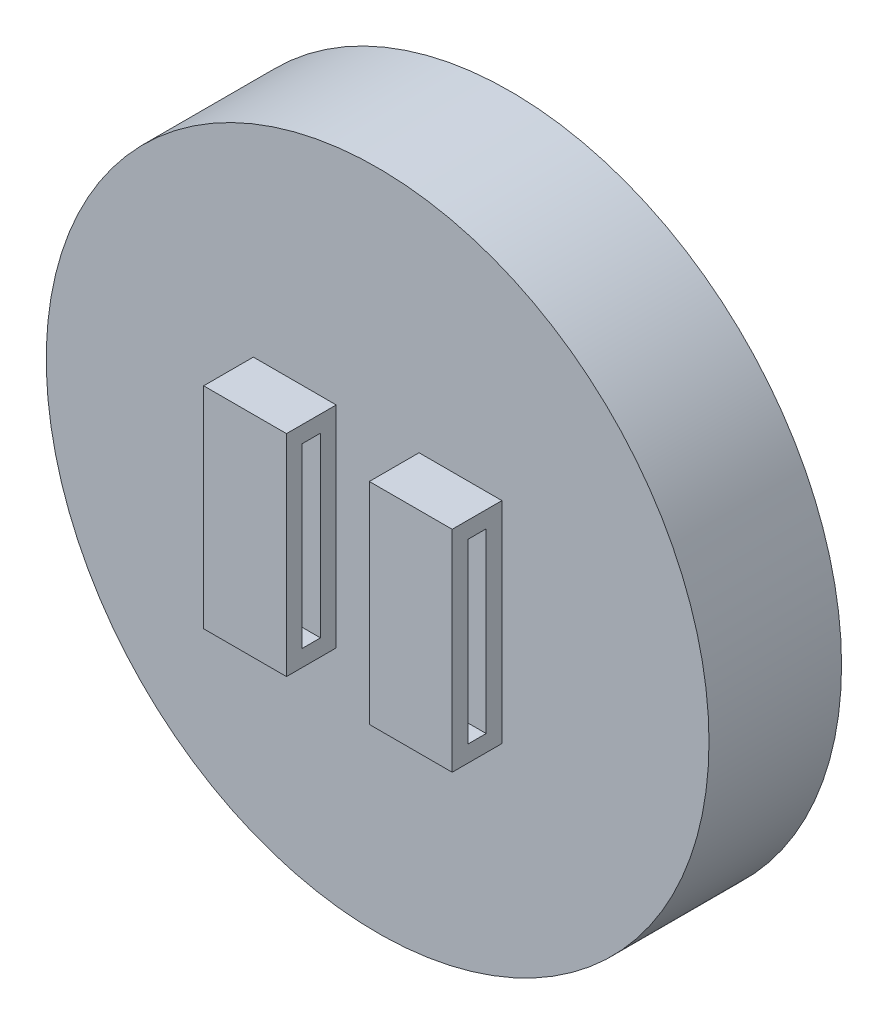
ISO-10303-21;
HEADER;
FILE_DESCRIPTION(('STEP AP214'),'2;1');
FILE_NAME('part.step','',(''),(''),'','','');
FILE_SCHEMA(('AUTOMOTIVE_DESIGN { 1 0 10303 214 1 1 1 1 }'));
ENDSEC;
DATA;
#1=APPLICATION_CONTEXT('core data for automotive mechanical design processes');
#2=APPLICATION_PROTOCOL_DEFINITION('international standard','automotive_design',2000,#1);
#3=PRODUCT_CONTEXT('',#1,'mechanical');
#4=PRODUCT('Part','Part','',(#3));
#5=PRODUCT_RELATED_PRODUCT_CATEGORY('part','',(#4));
#6=PRODUCT_DEFINITION_FORMATION('','',#4);
#7=PRODUCT_DEFINITION_CONTEXT('part definition',#1,'design');
#8=PRODUCT_DEFINITION('design','',#6,#7);
#9=PRODUCT_DEFINITION_SHAPE('','',#8);
#10=(LENGTH_UNIT() NAMED_UNIT(*) SI_UNIT(.MILLI.,.METRE.));
#11=(NAMED_UNIT(*) PLANE_ANGLE_UNIT() SI_UNIT($,.RADIAN.));
#12=(NAMED_UNIT(*) SI_UNIT($,.STERADIAN.) SOLID_ANGLE_UNIT());
#13=UNCERTAINTY_MEASURE_WITH_UNIT(LENGTH_MEASURE(1.E-05),#10,'distance_accuracy_value','');
#14=(GEOMETRIC_REPRESENTATION_CONTEXT(3) GLOBAL_UNCERTAINTY_ASSIGNED_CONTEXT((#13)) GLOBAL_UNIT_ASSIGNED_CONTEXT((#10,
#11,#12)) REPRESENTATION_CONTEXT('',''));
#15=CARTESIAN_POINT('',(0.,0.,0.));
#16=DIRECTION('',(0.,0.,1.));
#17=DIRECTION('',(1.,0.,0.));
#18=AXIS2_PLACEMENT_3D('',#15,#16,#17);
#19=CARTESIAN_POINT('',(0.,0.,8.));
#20=DIRECTION('',(0.,0.,-1.));
#21=DIRECTION('',(-1.,0.,0.));
#22=AXIS2_PLACEMENT_3D('',#19,#20,#21);
#23=CYLINDRICAL_SURFACE('',#22,20.);
#24=CARTESIAN_POINT('',(0.,0.,8.));
#25=DIRECTION('',(0.,0.,1.));
#26=DIRECTION('',(1.,0.,0.));
#27=AXIS2_PLACEMENT_3D('',#24,#25,#26);
#28=CIRCLE('',#27,20.);
#29=CARTESIAN_POINT('',(20.,0.,8.));
#30=VERTEX_POINT('',#29);
#31=EDGE_CURVE('E321',#30,#30,#28,.T.);
#32=ORIENTED_EDGE('',*,*,#31,.F.);
#33=EDGE_LOOP('',(#32));
#34=FACE_BOUND('',#33,.T.);
#35=CARTESIAN_POINT('',(0.,0.,0.));
#36=DIRECTION('',(0.,0.,1.));
#37=DIRECTION('',(1.,0.,0.));
#38=AXIS2_PLACEMENT_3D('',#35,#36,#37);
#39=CIRCLE('',#38,20.);
#40=CARTESIAN_POINT('',(20.,0.,0.));
#41=VERTEX_POINT('',#40);
#42=EDGE_CURVE('E317',#41,#41,#39,.T.);
#43=ORIENTED_EDGE('',*,*,#42,.T.);
#44=EDGE_LOOP('',(#43));
#45=FACE_BOUND('',#44,.T.);
#46=ADVANCED_FACE('F44',(#34,#45),#23,.T.);
#47=CARTESIAN_POINT('',(0.,0.,8.));
#48=DIRECTION('',(0.,0.,1.));
#49=DIRECTION('',(1.,0.,0.));
#50=AXIS2_PLACEMENT_3D('',#47,#48,#49);
#51=PLANE('',#50);
#52=DIRECTION('',(0.,1.,0.));
#53=VECTOR('',#52,1.);
#54=CARTESIAN_POINT('',(2.5,0.,8.));
#55=LINE('',#54,#53);
#56=CARTESIAN_POINT('',(2.5,-6.35,8.));
#57=VERTEX_POINT('',#56);
#58=CARTESIAN_POINT('',(2.5,6.35,8.));
#59=VERTEX_POINT('',#58);
#60=EDGE_CURVE('E223',#57,#59,#55,.T.);
#61=ORIENTED_EDGE('',*,*,#60,.T.);
#62=DIRECTION('',(1.,0.,0.));
#63=VECTOR('',#62,1.);
#64=CARTESIAN_POINT('',(0.,6.35,8.));
#65=LINE('',#64,#63);
#66=CARTESIAN_POINT('',(7.5,6.35,8.));
#67=VERTEX_POINT('',#66);
#68=EDGE_CURVE('E229',#59,#67,#65,.T.);
#69=ORIENTED_EDGE('',*,*,#68,.T.);
#70=DIRECTION('',(0.,1.,0.));
#71=VECTOR('',#70,1.);
#72=CARTESIAN_POINT('',(7.5,0.,8.));
#73=LINE('',#72,#71);
#74=CARTESIAN_POINT('',(7.5,-6.35,8.));
#75=VERTEX_POINT('',#74);
#76=EDGE_CURVE('E246',#75,#67,#73,.T.);
#77=ORIENTED_EDGE('',*,*,#76,.F.);
#78=DIRECTION('',(1.,0.,0.));
#79=VECTOR('',#78,1.);
#80=CARTESIAN_POINT('',(0.,-6.35,8.));
#81=LINE('',#80,#79);
#82=EDGE_CURVE('E242',#57,#75,#81,.T.);
#83=ORIENTED_EDGE('',*,*,#82,.F.);
#84=EDGE_LOOP('',(#61,#69,#77,#83));
#85=FACE_BOUND('',#84,.T.);
#86=DIRECTION('',(1.,0.,0.));
#87=VECTOR('',#86,1.);
#88=CARTESIAN_POINT('',(0.,-6.35,8.));
#89=LINE('',#88,#87);
#90=CARTESIAN_POINT('',(-7.5,-6.35,8.));
#91=VERTEX_POINT('',#90);
#92=CARTESIAN_POINT('',(-2.5,-6.35,8.));
#93=VERTEX_POINT('',#92);
#94=EDGE_CURVE('E267',#91,#93,#89,.T.);
#95=ORIENTED_EDGE('',*,*,#94,.F.);
#96=DIRECTION('',(0.,1.,0.));
#97=VECTOR('',#96,1.);
#98=CARTESIAN_POINT('',(-7.5,0.,8.));
#99=LINE('',#98,#97);
#100=CARTESIAN_POINT('',(-7.5,6.35,8.));
#101=VERTEX_POINT('',#100);
#102=EDGE_CURVE('E273',#91,#101,#99,.T.);
#103=ORIENTED_EDGE('',*,*,#102,.T.);
#104=DIRECTION('',(1.,0.,0.));
#105=VECTOR('',#104,1.);
#106=CARTESIAN_POINT('',(0.,6.35,8.));
#107=LINE('',#106,#105);
#108=CARTESIAN_POINT('',(-2.5,6.35,8.));
#109=VERTEX_POINT('',#108);
#110=EDGE_CURVE('E292',#101,#109,#107,.T.);
#111=ORIENTED_EDGE('',*,*,#110,.T.);
#112=DIRECTION('',(0.,1.,0.));
#113=VECTOR('',#112,1.);
#114=CARTESIAN_POINT('',(-2.5,0.,8.));
#115=LINE('',#114,#113);
#116=EDGE_CURVE('E288',#93,#109,#115,.T.);
#117=ORIENTED_EDGE('',*,*,#116,.F.);
#118=EDGE_LOOP('',(#95,#103,#111,#117));
#119=FACE_BOUND('',#118,.T.);
#120=ORIENTED_EDGE('',*,*,#31,.T.);
#121=EDGE_LOOP('',(#120));
#122=FACE_BOUND('',#121,.T.);
#123=ADVANCED_FACE('F372',(#85,#119,#122),#51,.T.);
#124=CARTESIAN_POINT('',(0.,0.,0.));
#125=DIRECTION('',(0.,0.,1.));
#126=DIRECTION('',(1.,0.,0.));
#127=AXIS2_PLACEMENT_3D('',#124,#125,#126);
#128=PLANE('',#127);
#129=CARTESIAN_POINT('',(0.,0.,0.));
#130=DIRECTION('',(0.,0.,-1.));
#131=DIRECTION('',(-1.,0.,0.));
#132=AXIS2_PLACEMENT_3D('',#129,#130,#131);
#133=CIRCLE('',#132,16.);
#134=CARTESIAN_POINT('',(-16.,0.,0.));
#135=VERTEX_POINT('',#134);
#136=EDGE_CURVE('E312',#135,#135,#133,.T.);
#137=ORIENTED_EDGE('',*,*,#136,.F.);
#138=EDGE_LOOP('',(#137));
#139=FACE_BOUND('',#138,.T.);
#140=ORIENTED_EDGE('',*,*,#42,.F.);
#141=EDGE_LOOP('',(#140));
#142=FACE_BOUND('',#141,.T.);
#143=ADVANCED_FACE('F397',(#139,#142),#128,.F.);
#144=CARTESIAN_POINT('',(0.,0.,6.35));
#145=DIRECTION('',(0.,0.,-1.));
#146=DIRECTION('',(-1.,0.,0.));
#147=AXIS2_PLACEMENT_3D('',#144,#145,#146);
#148=CYLINDRICAL_SURFACE('',#147,16.);
#149=CARTESIAN_POINT('',(0.,0.,6.35));
#150=DIRECTION('',(0.,0.,-1.));
#151=DIRECTION('',(-1.,0.,0.));
#152=AXIS2_PLACEMENT_3D('',#149,#150,#151);
#153=CIRCLE('',#152,16.);
#154=CARTESIAN_POINT('',(-16.,0.,6.35));
#155=VERTEX_POINT('',#154);
#156=EDGE_CURVE('E313',#155,#155,#153,.T.);
#157=ORIENTED_EDGE('',*,*,#156,.F.);
#158=EDGE_LOOP('',(#157));
#159=FACE_BOUND('',#158,.T.);
#160=ORIENTED_EDGE('',*,*,#136,.T.);
#161=EDGE_LOOP('',(#160));
#162=FACE_BOUND('',#161,.T.);
#163=ADVANCED_FACE('F404',(#159,#162),#148,.F.);
#164=CARTESIAN_POINT('',(0.,0.,6.35));
#165=DIRECTION('',(0.,0.,-1.));
#166=DIRECTION('',(-1.,0.,0.));
#167=AXIS2_PLACEMENT_3D('',#164,#165,#166);
#168=PLANE('',#167);
#169=ORIENTED_EDGE('',*,*,#156,.T.);
#170=EDGE_LOOP('',(#169));
#171=FACE_BOUND('',#170,.T.);
#172=ADVANCED_FACE('F409',(#171),#168,.T.);
#173=CARTESIAN_POINT('',(0.,-6.35,11.));
#174=DIRECTION('',(0.,1.,0.));
#175=DIRECTION('',(-1.,0.,0.));
#176=AXIS2_PLACEMENT_3D('',#173,#174,#175);
#177=PLANE('',#176);
#178=ORIENTED_EDGE('',*,*,#94,.T.);
#179=DIRECTION('',(0.,0.,-1.));
#180=VECTOR('',#179,1.);
#181=CARTESIAN_POINT('',(-2.5,-6.35,11.));
#182=LINE('',#181,#180);
#183=CARTESIAN_POINT('',(-2.5,-6.35,11.));
#184=VERTEX_POINT('',#183);
#185=EDGE_CURVE('E308',#184,#93,#182,.T.);
#186=ORIENTED_EDGE('',*,*,#185,.F.);
#187=DIRECTION('',(1.,0.,0.));
#188=VECTOR('',#187,1.);
#189=CARTESIAN_POINT('',(0.,-6.35,11.));
#190=LINE('',#189,#188);
#191=CARTESIAN_POINT('',(-7.5,-6.35,11.));
#192=VERTEX_POINT('',#191);
#193=EDGE_CURVE('E268',#192,#184,#190,.T.);
#194=ORIENTED_EDGE('',*,*,#193,.F.);
#195=DIRECTION('',(0.,0.,-1.));
#196=VECTOR('',#195,1.);
#197=CARTESIAN_POINT('',(-7.5,-6.35,11.));
#198=LINE('',#197,#196);
#199=EDGE_CURVE('E284',#192,#91,#198,.T.);
#200=ORIENTED_EDGE('',*,*,#199,.T.);
#201=EDGE_LOOP('',(#178,#186,#194,#200));
#202=FACE_BOUND('',#201,.T.);
#203=ADVANCED_FACE('F416',(#202),#177,.F.);
#204=CARTESIAN_POINT('',(-2.5,0.,11.));
#205=DIRECTION('',(-1.,0.,0.));
#206=DIRECTION('',(0.,0.,1.));
#207=AXIS2_PLACEMENT_3D('',#204,#205,#206);
#208=PLANE('',#207);
#209=DIRECTION('',(0.,1.,0.));
#210=VECTOR('',#209,1.);
#211=CARTESIAN_POINT('',(-2.5,0.,8.95));
#212=LINE('',#211,#210);
#213=CARTESIAN_POINT('',(-2.5,-5.35,8.95));
#214=VERTEX_POINT('',#213);
#215=CARTESIAN_POINT('',(-2.5,5.35,8.95));
#216=VERTEX_POINT('',#215);
#217=EDGE_CURVE('E212',#214,#216,#212,.T.);
#218=ORIENTED_EDGE('',*,*,#217,.F.);
#219=DIRECTION('',(0.,0.,1.));
#220=VECTOR('',#219,1.);
#221=CARTESIAN_POINT('',(-2.5,-5.35,11.));
#222=LINE('',#221,#220);
#223=CARTESIAN_POINT('',(-2.5,-5.35,10.05));
#224=VERTEX_POINT('',#223);
#225=EDGE_CURVE('E219',#214,#224,#222,.T.);
#226=ORIENTED_EDGE('',*,*,#225,.T.);
#227=DIRECTION('',(0.,1.,0.));
#228=VECTOR('',#227,1.);
#229=CARTESIAN_POINT('',(-2.5,0.,10.05));
#230=LINE('',#229,#228);
#231=CARTESIAN_POINT('',(-2.5,5.35,10.05));
#232=VERTEX_POINT('',#231);
#233=EDGE_CURVE('E199',#224,#232,#230,.T.);
#234=ORIENTED_EDGE('',*,*,#233,.T.);
#235=DIRECTION('',(0.,0.,1.));
#236=VECTOR('',#235,1.);
#237=CARTESIAN_POINT('',(-2.5,5.35,11.));
#238=LINE('',#237,#236);
#239=EDGE_CURVE('E163',#216,#232,#238,.T.);
#240=ORIENTED_EDGE('',*,*,#239,.F.);
#241=EDGE_LOOP('',(#218,#226,#234,#240));
#242=FACE_BOUND('',#241,.T.);
#243=ORIENTED_EDGE('',*,*,#116,.T.);
#244=DIRECTION('',(0.,0.,-1.));
#245=VECTOR('',#244,1.);
#246=CARTESIAN_POINT('',(-2.5,6.35,11.));
#247=LINE('',#246,#245);
#248=CARTESIAN_POINT('',(-2.5,6.35,11.));
#249=VERTEX_POINT('',#248);
#250=EDGE_CURVE('E304',#249,#109,#247,.T.);
#251=ORIENTED_EDGE('',*,*,#250,.F.);
#252=DIRECTION('',(0.,1.,0.));
#253=VECTOR('',#252,1.);
#254=CARTESIAN_POINT('',(-2.5,0.,11.));
#255=LINE('',#254,#253);
#256=EDGE_CURVE('E272',#184,#249,#255,.T.);
#257=ORIENTED_EDGE('',*,*,#256,.F.);
#258=ORIENTED_EDGE('',*,*,#185,.T.);
#259=EDGE_LOOP('',(#243,#251,#257,#258));
#260=FACE_BOUND('',#259,.T.);
#261=ADVANCED_FACE('F420',(#242,#260),#208,.F.);
#262=CARTESIAN_POINT('',(0.,6.35,11.));
#263=DIRECTION('',(0.,1.,0.));
#264=DIRECTION('',(-1.,0.,0.));
#265=AXIS2_PLACEMENT_3D('',#262,#263,#264);
#266=PLANE('',#265);
#267=ORIENTED_EDGE('',*,*,#110,.F.);
#268=DIRECTION('',(0.,0.,-1.));
#269=VECTOR('',#268,1.);
#270=CARTESIAN_POINT('',(-7.5,6.35,11.));
#271=LINE('',#270,#269);
#272=CARTESIAN_POINT('',(-7.5,6.35,11.));
#273=VERTEX_POINT('',#272);
#274=EDGE_CURVE('E300',#273,#101,#271,.T.);
#275=ORIENTED_EDGE('',*,*,#274,.F.);
#276=DIRECTION('',(1.,0.,0.));
#277=VECTOR('',#276,1.);
#278=CARTESIAN_POINT('',(0.,6.35,11.));
#279=LINE('',#278,#277);
#280=EDGE_CURVE('E276',#273,#249,#279,.T.);
#281=ORIENTED_EDGE('',*,*,#280,.T.);
#282=ORIENTED_EDGE('',*,*,#250,.T.);
#283=EDGE_LOOP('',(#267,#275,#281,#282));
#284=FACE_BOUND('',#283,.T.);
#285=ADVANCED_FACE('F424',(#284),#266,.T.);
#286=CARTESIAN_POINT('',(-7.5,0.,11.));
#287=DIRECTION('',(-1.,0.,0.));
#288=DIRECTION('',(0.,0.,1.));
#289=AXIS2_PLACEMENT_3D('',#286,#287,#288);
#290=PLANE('',#289);
#291=DIRECTION('',(0.,0.,1.));
#292=VECTOR('',#291,1.);
#293=CARTESIAN_POINT('',(-7.5,-5.35,0.));
#294=LINE('',#293,#292);
#295=CARTESIAN_POINT('',(-7.5,-5.35,8.95));
#296=VERTEX_POINT('',#295);
#297=CARTESIAN_POINT('',(-7.5,-5.35,10.05));
#298=VERTEX_POINT('',#297);
#299=EDGE_CURVE('E67',#296,#298,#294,.T.);
#300=ORIENTED_EDGE('',*,*,#299,.F.);
#301=DIRECTION('',(0.,1.,0.));
#302=VECTOR('',#301,1.);
#303=CARTESIAN_POINT('',(-7.5,0.,8.95));
#304=LINE('',#303,#302);
#305=CARTESIAN_POINT('',(-7.5,5.35,8.95));
#306=VERTEX_POINT('',#305);
#307=EDGE_CURVE('E179',#296,#306,#304,.T.);
#308=ORIENTED_EDGE('',*,*,#307,.T.);
#309=DIRECTION('',(0.,0.,1.));
#310=VECTOR('',#309,1.);
#311=CARTESIAN_POINT('',(-7.5,5.35,0.));
#312=LINE('',#311,#310);
#313=CARTESIAN_POINT('',(-7.5,5.35,10.05));
#314=VERTEX_POINT('',#313);
#315=EDGE_CURVE('E160',#306,#314,#312,.T.);
#316=ORIENTED_EDGE('',*,*,#315,.T.);
#317=DIRECTION('',(0.,1.,0.));
#318=VECTOR('',#317,1.);
#319=CARTESIAN_POINT('',(-7.5,0.,10.05));
#320=LINE('',#319,#318);
#321=EDGE_CURVE('E170',#298,#314,#320,.T.);
#322=ORIENTED_EDGE('',*,*,#321,.F.);
#323=EDGE_LOOP('',(#300,#308,#316,#322));
#324=FACE_BOUND('',#323,.T.);
#325=ORIENTED_EDGE('',*,*,#102,.F.);
#326=ORIENTED_EDGE('',*,*,#199,.F.);
#327=DIRECTION('',(0.,1.,0.));
#328=VECTOR('',#327,1.);
#329=CARTESIAN_POINT('',(-7.5,0.,11.));
#330=LINE('',#329,#328);
#331=EDGE_CURVE('E280',#192,#273,#330,.T.);
#332=ORIENTED_EDGE('',*,*,#331,.T.);
#333=ORIENTED_EDGE('',*,*,#274,.T.);
#334=EDGE_LOOP('',(#325,#326,#332,#333));
#335=FACE_BOUND('',#334,.T.);
#336=ADVANCED_FACE('F176',(#324,#335),#290,.T.);
#337=CARTESIAN_POINT('',(0.,0.,11.));
#338=DIRECTION('',(0.,0.,1.));
#339=DIRECTION('',(1.,0.,0.));
#340=AXIS2_PLACEMENT_3D('',#337,#338,#339);
#341=PLANE('',#340);
#342=ORIENTED_EDGE('',*,*,#193,.T.);
#343=ORIENTED_EDGE('',*,*,#256,.T.);
#344=ORIENTED_EDGE('',*,*,#280,.F.);
#345=ORIENTED_EDGE('',*,*,#331,.F.);
#346=EDGE_LOOP('',(#342,#343,#344,#345));
#347=FACE_BOUND('',#346,.T.);
#348=ADVANCED_FACE('F366',(#347),#341,.T.);
#349=CARTESIAN_POINT('',(2.5,0.,11.));
#350=DIRECTION('',(-1.,0.,0.));
#351=DIRECTION('',(0.,-1.,0.));
#352=AXIS2_PLACEMENT_3D('',#349,#350,#351);
#353=PLANE('',#352);
#354=DIRECTION('',(0.,0.,1.));
#355=VECTOR('',#354,1.);
#356=CARTESIAN_POINT('',(2.5,-5.35,11.));
#357=LINE('',#356,#355);
#358=CARTESIAN_POINT('',(2.5,-5.35,8.95));
#359=VERTEX_POINT('',#358);
#360=CARTESIAN_POINT('',(2.5,-5.35,10.05));
#361=VERTEX_POINT('',#360);
#362=EDGE_CURVE('E215',#359,#361,#357,.T.);
#363=ORIENTED_EDGE('',*,*,#362,.F.);
#364=DIRECTION('',(0.,1.,0.));
#365=VECTOR('',#364,1.);
#366=CARTESIAN_POINT('',(2.5,0.,8.95));
#367=LINE('',#366,#365);
#368=CARTESIAN_POINT('',(2.5,5.35,8.95));
#369=VERTEX_POINT('',#368);
#370=EDGE_CURVE('E208',#359,#369,#367,.T.);
#371=ORIENTED_EDGE('',*,*,#370,.T.);
#372=DIRECTION('',(0.,0.,1.));
#373=VECTOR('',#372,1.);
#374=CARTESIAN_POINT('',(2.5,5.35,11.));
#375=LINE('',#374,#373);
#376=CARTESIAN_POINT('',(2.5,5.35,10.05));
#377=VERTEX_POINT('',#376);
#378=EDGE_CURVE('E202',#369,#377,#375,.T.);
#379=ORIENTED_EDGE('',*,*,#378,.T.);
#380=DIRECTION('',(0.,1.,0.));
#381=VECTOR('',#380,1.);
#382=CARTESIAN_POINT('',(2.5,0.,10.05));
#383=LINE('',#382,#381);
#384=EDGE_CURVE('E196',#361,#377,#383,.T.);
#385=ORIENTED_EDGE('',*,*,#384,.F.);
#386=EDGE_LOOP('',(#363,#371,#379,#385));
#387=FACE_BOUND('',#386,.T.);
#388=ORIENTED_EDGE('',*,*,#60,.F.);
#389=DIRECTION('',(0.,0.,-1.));
#390=VECTOR('',#389,1.);
#391=CARTESIAN_POINT('',(2.5,-6.35,11.));
#392=LINE('',#391,#390);
#393=CARTESIAN_POINT('',(2.5,-6.35,11.));
#394=VERTEX_POINT('',#393);
#395=EDGE_CURVE('E263',#394,#57,#392,.T.);
#396=ORIENTED_EDGE('',*,*,#395,.F.);
#397=DIRECTION('',(0.,1.,0.));
#398=VECTOR('',#397,1.);
#399=CARTESIAN_POINT('',(2.5,0.,11.));
#400=LINE('',#399,#398);
#401=CARTESIAN_POINT('',(2.5,6.35,11.));
#402=VERTEX_POINT('',#401);
#403=EDGE_CURVE('E224',#394,#402,#400,.T.);
#404=ORIENTED_EDGE('',*,*,#403,.T.);
#405=DIRECTION('',(0.,0.,-1.));
#406=VECTOR('',#405,1.);
#407=CARTESIAN_POINT('',(2.5,6.35,11.));
#408=LINE('',#407,#406);
#409=EDGE_CURVE('E239',#402,#59,#408,.T.);
#410=ORIENTED_EDGE('',*,*,#409,.T.);
#411=EDGE_LOOP('',(#388,#396,#404,#410));
#412=FACE_BOUND('',#411,.T.);
#413=ADVANCED_FACE('F362',(#387,#412),#353,.T.);
#414=CARTESIAN_POINT('',(0.,-6.35,11.));
#415=DIRECTION('',(0.,1.,0.));
#416=DIRECTION('',(0.,0.,1.));
#417=AXIS2_PLACEMENT_3D('',#414,#415,#416);
#418=PLANE('',#417);
#419=ORIENTED_EDGE('',*,*,#82,.T.);
#420=DIRECTION('',(0.,0.,-1.));
#421=VECTOR('',#420,1.);
#422=CARTESIAN_POINT('',(7.5,-6.35,11.));
#423=LINE('',#422,#421);
#424=CARTESIAN_POINT('',(7.5,-6.35,11.));
#425=VERTEX_POINT('',#424);
#426=EDGE_CURVE('E259',#425,#75,#423,.T.);
#427=ORIENTED_EDGE('',*,*,#426,.F.);
#428=DIRECTION('',(1.,0.,0.));
#429=VECTOR('',#428,1.);
#430=CARTESIAN_POINT('',(0.,-6.35,11.));
#431=LINE('',#430,#429);
#432=EDGE_CURVE('E228',#394,#425,#431,.T.);
#433=ORIENTED_EDGE('',*,*,#432,.F.);
#434=ORIENTED_EDGE('',*,*,#395,.T.);
#435=EDGE_LOOP('',(#419,#427,#433,#434));
#436=FACE_BOUND('',#435,.T.);
#437=ADVANCED_FACE('F365',(#436),#418,.F.);
#438=CARTESIAN_POINT('',(7.5,0.,11.));
#439=DIRECTION('',(-1.,0.,0.));
#440=DIRECTION('',(0.,-1.,0.));
#441=AXIS2_PLACEMENT_3D('',#438,#439,#440);
#442=PLANE('',#441);
#443=DIRECTION('',(0.,1.,0.));
#444=VECTOR('',#443,1.);
#445=CARTESIAN_POINT('',(7.5,0.,8.95));
#446=LINE('',#445,#444);
#447=CARTESIAN_POINT('',(7.50000000000001,-5.35,8.95));
#448=VERTEX_POINT('',#447);
#449=CARTESIAN_POINT('',(7.50000000000001,5.35,8.95));
#450=VERTEX_POINT('',#449);
#451=EDGE_CURVE('E52',#448,#450,#446,.T.);
#452=ORIENTED_EDGE('',*,*,#451,.F.);
#453=DIRECTION('',(0.,0.,1.));
#454=VECTOR('',#453,1.);
#455=CARTESIAN_POINT('',(7.5,-5.35,11.));
#456=LINE('',#455,#454);
#457=CARTESIAN_POINT('',(7.50000000000001,-5.35,10.05));
#458=VERTEX_POINT('',#457);
#459=EDGE_CURVE('E11',#448,#458,#456,.T.);
#460=ORIENTED_EDGE('',*,*,#459,.T.);
#461=DIRECTION('',(0.,1.,0.));
#462=VECTOR('',#461,1.);
#463=CARTESIAN_POINT('',(7.5,0.,10.05));
#464=LINE('',#463,#462);
#465=CARTESIAN_POINT('',(7.5,5.35,10.05));
#466=VERTEX_POINT('',#465);
#467=EDGE_CURVE('E325',#458,#466,#464,.T.);
#468=ORIENTED_EDGE('',*,*,#467,.T.);
#469=DIRECTION('',(0.,0.,1.));
#470=VECTOR('',#469,1.);
#471=CARTESIAN_POINT('',(7.5,5.35,11.));
#472=LINE('',#471,#470);
#473=EDGE_CURVE('E332',#450,#466,#472,.T.);
#474=ORIENTED_EDGE('',*,*,#473,.F.);
#475=EDGE_LOOP('',(#452,#460,#468,#474));
#476=FACE_BOUND('',#475,.T.);
#477=ORIENTED_EDGE('',*,*,#76,.T.);
#478=DIRECTION('',(0.,0.,-1.));
#479=VECTOR('',#478,1.);
#480=CARTESIAN_POINT('',(7.5,6.35,11.));
#481=LINE('',#480,#479);
#482=CARTESIAN_POINT('',(7.5,6.35,11.));
#483=VERTEX_POINT('',#482);
#484=EDGE_CURVE('E255',#483,#67,#481,.T.);
#485=ORIENTED_EDGE('',*,*,#484,.F.);
#486=DIRECTION('',(0.,1.,0.));
#487=VECTOR('',#486,1.);
#488=CARTESIAN_POINT('',(7.5,0.,11.));
#489=LINE('',#488,#487);
#490=EDGE_CURVE('E232',#425,#483,#489,.T.);
#491=ORIENTED_EDGE('',*,*,#490,.F.);
#492=ORIENTED_EDGE('',*,*,#426,.T.);
#493=EDGE_LOOP('',(#477,#485,#491,#492));
#494=FACE_BOUND('',#493,.T.);
#495=ADVANCED_FACE('F349',(#476,#494),#442,.F.);
#496=CARTESIAN_POINT('',(0.,6.35,11.));
#497=DIRECTION('',(0.,1.,0.));
#498=DIRECTION('',(0.,0.,1.));
#499=AXIS2_PLACEMENT_3D('',#496,#497,#498);
#500=PLANE('',#499);
#501=ORIENTED_EDGE('',*,*,#68,.F.);
#502=ORIENTED_EDGE('',*,*,#409,.F.);
#503=DIRECTION('',(1.,0.,0.));
#504=VECTOR('',#503,1.);
#505=CARTESIAN_POINT('',(0.,6.35,11.));
#506=LINE('',#505,#504);
#507=EDGE_CURVE('E235',#402,#483,#506,.T.);
#508=ORIENTED_EDGE('',*,*,#507,.T.);
#509=ORIENTED_EDGE('',*,*,#484,.T.);
#510=EDGE_LOOP('',(#501,#502,#508,#509));
#511=FACE_BOUND('',#510,.T.);
#512=ADVANCED_FACE('F383',(#511),#500,.T.);
#513=CARTESIAN_POINT('',(0.,0.,11.));
#514=DIRECTION('',(0.,0.,1.));
#515=DIRECTION('',(1.,0.,0.));
#516=AXIS2_PLACEMENT_3D('',#513,#514,#515);
#517=PLANE('',#516);
#518=ORIENTED_EDGE('',*,*,#403,.F.);
#519=ORIENTED_EDGE('',*,*,#432,.T.);
#520=ORIENTED_EDGE('',*,*,#490,.T.);
#521=ORIENTED_EDGE('',*,*,#507,.F.);
#522=EDGE_LOOP('',(#518,#519,#520,#521));
#523=FACE_BOUND('',#522,.T.);
#524=ADVANCED_FACE('F380',(#523),#517,.T.);
#525=CARTESIAN_POINT('',(170.3,0.,10.05));
#526=DIRECTION('',(0.,0.,1.));
#527=DIRECTION('',(1.,0.,0.));
#528=AXIS2_PLACEMENT_3D('',#525,#526,#527);
#529=PLANE('',#528);
#530=ORIENTED_EDGE('',*,*,#384,.T.);
#531=DIRECTION('',(-1.,0.,0.));
#532=VECTOR('',#531,1.);
#533=CARTESIAN_POINT('',(170.3,5.35,10.05));
#534=LINE('',#533,#532);
#535=EDGE_CURVE('E166',#466,#377,#534,.T.);
#536=ORIENTED_EDGE('',*,*,#535,.F.);
#537=ORIENTED_EDGE('',*,*,#467,.F.);
#538=DIRECTION('',(-1.,0.,0.));
#539=VECTOR('',#538,1.);
#540=CARTESIAN_POINT('',(170.3,-5.35,10.05));
#541=LINE('',#540,#539);
#542=EDGE_CURVE('E167',#458,#361,#541,.T.);
#543=ORIENTED_EDGE('',*,*,#542,.T.);
#544=EDGE_LOOP('',(#530,#536,#537,#543));
#545=FACE_BOUND('',#544,.T.);
#546=ADVANCED_FACE('F353',(#545),#529,.F.);
#547=CARTESIAN_POINT('',(170.3,5.35,0.));
#548=DIRECTION('',(0.,-1.,0.));
#549=DIRECTION('',(0.,0.,-1.));
#550=AXIS2_PLACEMENT_3D('',#547,#548,#549);
#551=PLANE('',#550);
#552=DIRECTION('',(-1.,0.,0.));
#553=VECTOR('',#552,1.);
#554=CARTESIAN_POINT('',(170.3,5.35,8.95));
#555=LINE('',#554,#553);
#556=EDGE_CURVE('E190',#450,#369,#555,.T.);
#557=ORIENTED_EDGE('',*,*,#556,.F.);
#558=ORIENTED_EDGE('',*,*,#473,.T.);
#559=ORIENTED_EDGE('',*,*,#535,.T.);
#560=ORIENTED_EDGE('',*,*,#378,.F.);
#561=EDGE_LOOP('',(#557,#558,#559,#560));
#562=FACE_BOUND('',#561,.T.);
#563=ADVANCED_FACE('F346',(#562),#551,.T.);
#564=CARTESIAN_POINT('',(170.3,0.,8.95));
#565=DIRECTION('',(0.,0.,1.));
#566=DIRECTION('',(1.,0.,0.));
#567=AXIS2_PLACEMENT_3D('',#564,#565,#566);
#568=PLANE('',#567);
#569=DIRECTION('',(-1.,0.,0.));
#570=VECTOR('',#569,1.);
#571=CARTESIAN_POINT('',(170.3,-5.35,8.95));
#572=LINE('',#571,#570);
#573=EDGE_CURVE('E189',#448,#359,#572,.T.);
#574=ORIENTED_EDGE('',*,*,#573,.F.);
#575=ORIENTED_EDGE('',*,*,#451,.T.);
#576=ORIENTED_EDGE('',*,*,#556,.T.);
#577=ORIENTED_EDGE('',*,*,#370,.F.);
#578=EDGE_LOOP('',(#574,#575,#576,#577));
#579=FACE_BOUND('',#578,.T.);
#580=ADVANCED_FACE('F341',(#579),#568,.T.);
#581=CARTESIAN_POINT('',(170.3,-5.35,0.));
#582=DIRECTION('',(0.,-1.,0.));
#583=DIRECTION('',(0.,0.,-1.));
#584=AXIS2_PLACEMENT_3D('',#581,#582,#583);
#585=PLANE('',#584);
#586=ORIENTED_EDGE('',*,*,#362,.T.);
#587=ORIENTED_EDGE('',*,*,#542,.F.);
#588=ORIENTED_EDGE('',*,*,#459,.F.);
#589=ORIENTED_EDGE('',*,*,#573,.T.);
#590=EDGE_LOOP('',(#586,#587,#588,#589));
#591=FACE_BOUND('',#590,.T.);
#592=ADVANCED_FACE('F355',(#591),#585,.F.);
#593=EDGE_CURVE('E186',#214,#296,#572,.T.);
#594=ORIENTED_EDGE('',*,*,#593,.T.);
#595=ORIENTED_EDGE('',*,*,#299,.T.);
#596=EDGE_CURVE('E172',#224,#298,#541,.T.);
#597=ORIENTED_EDGE('',*,*,#596,.F.);
#598=ORIENTED_EDGE('',*,*,#225,.F.);
#599=EDGE_LOOP('',(#594,#595,#597,#598));
#600=FACE_BOUND('',#599,.T.);
#601=ADVANCED_FACE('F546',(#600),#585,.F.);
#602=ORIENTED_EDGE('',*,*,#217,.T.);
#603=EDGE_CURVE('E191',#216,#306,#555,.T.);
#604=ORIENTED_EDGE('',*,*,#603,.T.);
#605=ORIENTED_EDGE('',*,*,#307,.F.);
#606=ORIENTED_EDGE('',*,*,#593,.F.);
#607=EDGE_LOOP('',(#602,#604,#605,#606));
#608=FACE_BOUND('',#607,.T.);
#609=ADVANCED_FACE('F538',(#608),#568,.T.);
#610=ORIENTED_EDGE('',*,*,#239,.T.);
#611=EDGE_CURVE('E59',#232,#314,#534,.T.);
#612=ORIENTED_EDGE('',*,*,#611,.T.);
#613=ORIENTED_EDGE('',*,*,#315,.F.);
#614=ORIENTED_EDGE('',*,*,#603,.F.);
#615=EDGE_LOOP('',(#610,#612,#613,#614));
#616=FACE_BOUND('',#615,.T.);
#617=ADVANCED_FACE('F157',(#616),#551,.T.);
#618=ORIENTED_EDGE('',*,*,#596,.T.);
#619=ORIENTED_EDGE('',*,*,#321,.T.);
#620=ORIENTED_EDGE('',*,*,#611,.F.);
#621=ORIENTED_EDGE('',*,*,#233,.F.);
#622=EDGE_LOOP('',(#618,#619,#620,#621));
#623=FACE_BOUND('',#622,.T.);
#624=ADVANCED_FACE('F171',(#623),#529,.F.);
#625=CLOSED_SHELL('',(#46,#123,#143,#163,#172,#203,#261,#285,#336,#348,#413,#437,#495,#512,#524,
#546,#563,#580,#592,#601,#609,#617,#624));
#626=MANIFOLD_SOLID_BREP('B2',#625);
#627=ADVANCED_BREP_SHAPE_REPRESENTATION('',(#18,#626),#14);
#628=SHAPE_DEFINITION_REPRESENTATION(#9,#627);
ENDSEC;
END-ISO-10303-21;
